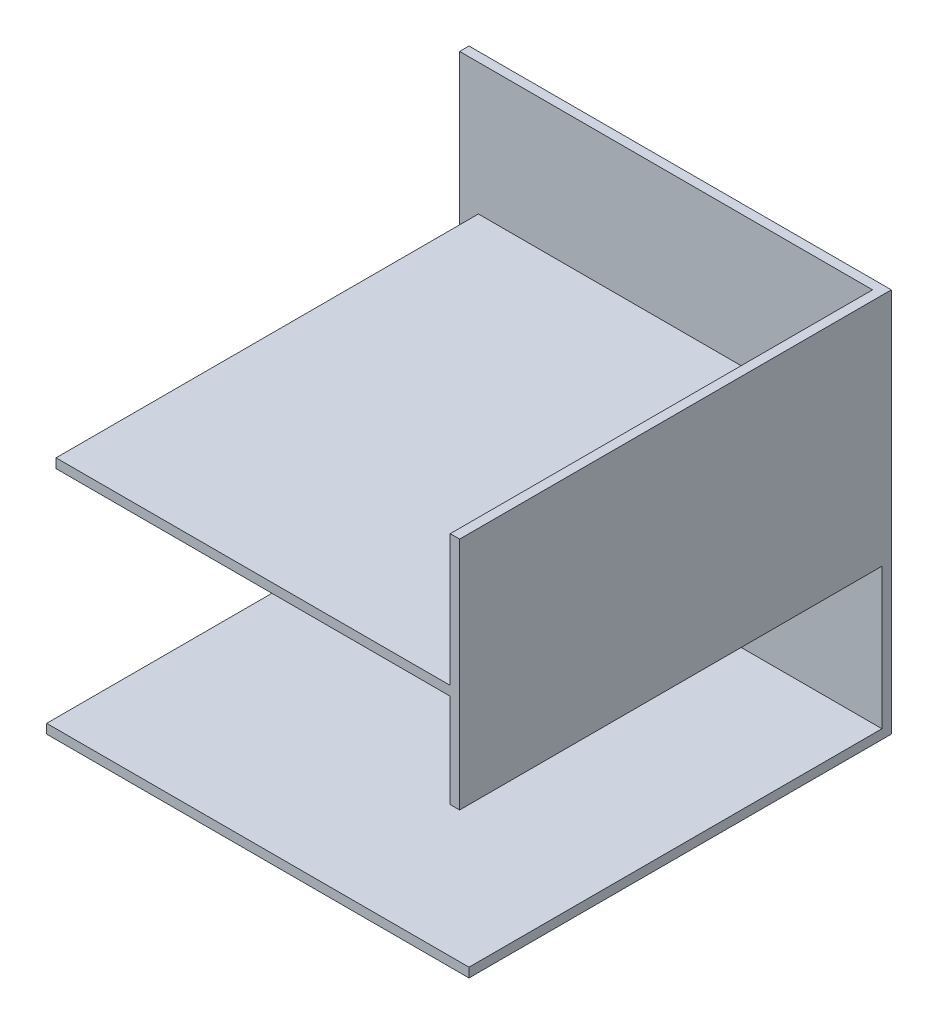
ISO-10303-21;
HEADER;
FILE_DESCRIPTION(('STEP AP214'),'2;1');
FILE_NAME('part.step','',(''),(''),'','','');
FILE_SCHEMA(('AUTOMOTIVE_DESIGN { 1 0 10303 214 1 1 1 1 }'));
ENDSEC;
DATA;
#1=APPLICATION_CONTEXT('core data for automotive mechanical design processes');
#2=APPLICATION_PROTOCOL_DEFINITION('international standard','automotive_design',2000,#1);
#3=PRODUCT_CONTEXT('',#1,'mechanical');
#4=PRODUCT('Part','Part','',(#3));
#5=PRODUCT_RELATED_PRODUCT_CATEGORY('part','',(#4));
#6=PRODUCT_DEFINITION_FORMATION('','',#4);
#7=PRODUCT_DEFINITION_CONTEXT('part definition',#1,'design');
#8=PRODUCT_DEFINITION('design','',#6,#7);
#9=PRODUCT_DEFINITION_SHAPE('','',#8);
#10=(LENGTH_UNIT() NAMED_UNIT(*) SI_UNIT(.MILLI.,.METRE.));
#11=(NAMED_UNIT(*) PLANE_ANGLE_UNIT() SI_UNIT($,.RADIAN.));
#12=(NAMED_UNIT(*) SI_UNIT($,.STERADIAN.) SOLID_ANGLE_UNIT());
#13=UNCERTAINTY_MEASURE_WITH_UNIT(LENGTH_MEASURE(1.E-05),#10,'distance_accuracy_value','');
#14=(GEOMETRIC_REPRESENTATION_CONTEXT(3) GLOBAL_UNCERTAINTY_ASSIGNED_CONTEXT((#13)) GLOBAL_UNIT_ASSIGNED_CONTEXT((#10,
#11,#12)) REPRESENTATION_CONTEXT('',''));
#15=CARTESIAN_POINT('',(0.,0.,0.));
#16=DIRECTION('',(0.,0.,1.));
#17=DIRECTION('',(1.,0.,0.));
#18=AXIS2_PLACEMENT_3D('',#15,#16,#17);
#19=CARTESIAN_POINT('',(-22.939262472885,404.753253796095,10.));
#20=DIRECTION('',(0.,0.,-1.));
#21=DIRECTION('',(-1.,0.,0.));
#22=AXIS2_PLACEMENT_3D('',#19,#20,#21);
#23=PLANE('',#22);
#24=DIRECTION('',(1.,0.,0.));
#25=VECTOR('',#24,1.);
#26=CARTESIAN_POINT('',(-2.93926247288504,254.753253796095,10.));
#27=LINE('',#26,#25);
#28=CARTESIAN_POINT('',(-2.93926247288504,254.753253796095,10.));
#29=VERTEX_POINT('',#28);
#30=CARTESIAN_POINT('',(417.060737527115,254.753253796095,10.));
#31=VERTEX_POINT('',#30);
#32=EDGE_CURVE('E338',#29,#31,#27,.T.);
#33=ORIENTED_EDGE('',*,*,#32,.F.);
#34=DIRECTION('',(0.,-1.,0.));
#35=VECTOR('',#34,1.);
#36=CARTESIAN_POINT('',(-2.93926247288504,264.753253796095,10.));
#37=LINE('',#36,#35);
#38=CARTESIAN_POINT('',(-2.93926247288504,264.753253796095,10.));
#39=VERTEX_POINT('',#38);
#40=EDGE_CURVE('E148',#39,#29,#37,.T.);
#41=ORIENTED_EDGE('',*,*,#40,.F.);
#42=DIRECTION('',(-1.,0.,0.));
#43=VECTOR('',#42,1.);
#44=CARTESIAN_POINT('',(-2.93926247288504,264.753253796095,10.));
#45=LINE('',#44,#43);
#46=CARTESIAN_POINT('',(417.060737527115,264.753253796096,10.));
#47=VERTEX_POINT('',#46);
#48=EDGE_CURVE('E144',#47,#39,#45,.T.);
#49=ORIENTED_EDGE('',*,*,#48,.F.);
#50=DIRECTION('',(0.,-1.,0.));
#51=VECTOR('',#50,1.);
#52=CARTESIAN_POINT('',(417.060737527115,404.753253796095,10.));
#53=LINE('',#52,#51);
#54=CARTESIAN_POINT('',(417.060737527115,404.753253796095,10.));
#55=VERTEX_POINT('',#54);
#56=EDGE_CURVE('E152',#55,#47,#53,.T.);
#57=ORIENTED_EDGE('',*,*,#56,.F.);
#58=DIRECTION('',(1.,0.,0.));
#59=VECTOR('',#58,1.);
#60=CARTESIAN_POINT('',(-22.939262472885,404.753253796095,10.));
#61=LINE('',#60,#59);
#62=CARTESIAN_POINT('',(-22.939262472885,404.753253796095,10.));
#63=VERTEX_POINT('',#62);
#64=EDGE_CURVE('E182',#63,#55,#61,.T.);
#65=ORIENTED_EDGE('',*,*,#64,.F.);
#66=DIRECTION('',(0.,-1.,0.));
#67=VECTOR('',#66,1.);
#68=CARTESIAN_POINT('',(-22.939262472885,404.753253796095,10.));
#69=LINE('',#68,#67);
#70=CARTESIAN_POINT('',(-22.939262472885,4.75325379609545,10.));
#71=VERTEX_POINT('',#70);
#72=EDGE_CURVE('E194',#63,#71,#69,.T.);
#73=ORIENTED_EDGE('',*,*,#72,.T.);
#74=DIRECTION('',(1.,0.,0.));
#75=VECTOR('',#74,1.);
#76=CARTESIAN_POINT('',(-22.939262472885,4.75325379609545,10.));
#77=LINE('',#76,#75);
#78=CARTESIAN_POINT('',(427.060737527115,4.75325379609545,10.));
#79=VERTEX_POINT('',#78);
#80=EDGE_CURVE('E56',#71,#79,#77,.T.);
#81=ORIENTED_EDGE('',*,*,#80,.T.);
#82=DIRECTION('',(0.,-1.,0.));
#83=VECTOR('',#82,1.);
#84=CARTESIAN_POINT('',(427.060737527115,404.753253796095,10.));
#85=LINE('',#84,#83);
#86=CARTESIAN_POINT('',(427.060737527115,154.753253796095,10.));
#87=VERTEX_POINT('',#86);
#88=EDGE_CURVE('E191',#87,#79,#85,.T.);
#89=ORIENTED_EDGE('',*,*,#88,.F.);
#90=DIRECTION('',(1.,0.,0.));
#91=VECTOR('',#90,1.);
#92=CARTESIAN_POINT('',(417.060737527115,154.753253796095,10.));
#93=LINE('',#92,#91);
#94=CARTESIAN_POINT('',(417.060737527115,154.753253796095,10.));
#95=VERTEX_POINT('',#94);
#96=EDGE_CURVE('E170',#95,#87,#93,.T.);
#97=ORIENTED_EDGE('',*,*,#96,.F.);
#98=EDGE_CURVE('E150',#31,#95,#53,.T.);
#99=ORIENTED_EDGE('',*,*,#98,.F.);
#100=EDGE_LOOP('',(#33,#41,#49,#57,#65,#73,#81,#89,#97,#99));
#101=FACE_BOUND('',#100,.T.);
#102=ADVANCED_FACE('F33',(#101),#23,.F.);
#103=CARTESIAN_POINT('',(417.060737527115,404.753253796095,460.));
#104=DIRECTION('',(1.,0.,0.));
#105=DIRECTION('',(0.,1.,0.));
#106=AXIS2_PLACEMENT_3D('',#103,#104,#105);
#107=PLANE('',#106);
#108=DIRECTION('',(0.,0.,-1.));
#109=VECTOR('',#108,1.);
#110=CARTESIAN_POINT('',(417.060737527115,254.753253796095,460.));
#111=LINE('',#110,#109);
#112=CARTESIAN_POINT('',(417.060737527115,254.753253796095,460.));
#113=VERTEX_POINT('',#112);
#114=EDGE_CURVE('E48',#113,#31,#111,.T.);
#115=ORIENTED_EDGE('',*,*,#114,.T.);
#116=ORIENTED_EDGE('',*,*,#98,.T.);
#117=DIRECTION('',(0.,0.,-1.));
#118=VECTOR('',#117,1.);
#119=CARTESIAN_POINT('',(417.060737527115,154.753253796095,460.));
#120=LINE('',#119,#118);
#121=CARTESIAN_POINT('',(417.060737527115,154.753253796095,460.));
#122=VERTEX_POINT('',#121);
#123=EDGE_CURVE('E176',#122,#95,#120,.T.);
#124=ORIENTED_EDGE('',*,*,#123,.F.);
#125=DIRECTION('',(0.,-1.,0.));
#126=VECTOR('',#125,1.);
#127=CARTESIAN_POINT('',(417.060737527115,404.753253796095,460.));
#128=LINE('',#127,#126);
#129=EDGE_CURVE('E161',#113,#122,#128,.T.);
#130=ORIENTED_EDGE('',*,*,#129,.F.);
#131=EDGE_LOOP('',(#115,#116,#124,#130));
#132=FACE_BOUND('',#131,.T.);
#133=ADVANCED_FACE('F253',(#132),#107,.F.);
#134=DIRECTION('',(0.,0.,-1.));
#135=VECTOR('',#134,1.);
#136=CARTESIAN_POINT('',(417.060737527115,264.753253796096,460.));
#137=LINE('',#136,#135);
#138=CARTESIAN_POINT('',(417.060737527115,264.753253796096,460.));
#139=VERTEX_POINT('',#138);
#140=EDGE_CURVE('E154',#139,#47,#137,.T.);
#141=ORIENTED_EDGE('',*,*,#140,.F.);
#142=CARTESIAN_POINT('',(417.060737527115,404.753253796095,460.));
#143=VERTEX_POINT('',#142);
#144=EDGE_CURVE('E158',#143,#139,#128,.T.);
#145=ORIENTED_EDGE('',*,*,#144,.F.);
#146=DIRECTION('',(0.,0.,-1.));
#147=VECTOR('',#146,1.);
#148=CARTESIAN_POINT('',(417.060737527115,404.753253796095,460.));
#149=LINE('',#148,#147);
#150=EDGE_CURVE('E167',#143,#55,#149,.T.);
#151=ORIENTED_EDGE('',*,*,#150,.T.);
#152=ORIENTED_EDGE('',*,*,#56,.T.);
#153=EDGE_LOOP('',(#141,#145,#151,#152));
#154=FACE_BOUND('',#153,.T.);
#155=ADVANCED_FACE('F243',(#154),#107,.F.);
#156=CARTESIAN_POINT('',(-22.939262472885,4.75325379609545,450.));
#157=DIRECTION('',(0.,-1.,0.));
#158=DIRECTION('',(0.,0.,-1.));
#159=AXIS2_PLACEMENT_3D('',#156,#157,#158);
#160=PLANE('',#159);
#161=ORIENTED_EDGE('',*,*,#80,.F.);
#162=DIRECTION('',(0.,0.,-1.));
#163=VECTOR('',#162,1.);
#164=CARTESIAN_POINT('',(-22.939262472885,4.75325379609545,450.));
#165=LINE('',#164,#163);
#166=CARTESIAN_POINT('',(-22.939262472885,4.75325379609545,450.));
#167=VERTEX_POINT('',#166);
#168=EDGE_CURVE('E208',#167,#71,#165,.T.);
#169=ORIENTED_EDGE('',*,*,#168,.F.);
#170=DIRECTION('',(-1.,0.,0.));
#171=VECTOR('',#170,1.);
#172=CARTESIAN_POINT('',(-22.939262472885,4.75325379609545,450.));
#173=LINE('',#172,#171);
#174=CARTESIAN_POINT('',(427.060737527115,4.75325379609545,450.));
#175=VERTEX_POINT('',#174);
#176=EDGE_CURVE('E206',#175,#167,#173,.T.);
#177=ORIENTED_EDGE('',*,*,#176,.F.);
#178=DIRECTION('',(0.,0.,-1.));
#179=VECTOR('',#178,1.);
#180=CARTESIAN_POINT('',(427.060737527115,4.75325379609545,450.));
#181=LINE('',#180,#179);
#182=EDGE_CURVE('E215',#175,#79,#181,.T.);
#183=ORIENTED_EDGE('',*,*,#182,.T.);
#184=EDGE_LOOP('',(#161,#169,#177,#183));
#185=FACE_BOUND('',#184,.T.);
#186=ADVANCED_FACE('F260',(#185),#160,.F.);
#187=CARTESIAN_POINT('',(-22.939262472885,4.75325379609545,450.));
#188=DIRECTION('',(1.,0.,0.));
#189=DIRECTION('',(0.,1.,0.));
#190=AXIS2_PLACEMENT_3D('',#187,#188,#189);
#191=PLANE('',#190);
#192=DIRECTION('',(0.,-1.,0.));
#193=VECTOR('',#192,1.);
#194=CARTESIAN_POINT('',(-22.939262472885,4.75325379609545,0.));
#195=LINE('',#194,#193);
#196=CARTESIAN_POINT('',(-22.939262472885,404.753253796095,0.));
#197=VERTEX_POINT('',#196);
#198=CARTESIAN_POINT('',(-22.939262472885,-5.24674620390455,0.));
#199=VERTEX_POINT('',#198);
#200=EDGE_CURVE('E197',#197,#199,#195,.T.);
#201=ORIENTED_EDGE('',*,*,#200,.T.);
#202=DIRECTION('',(0.,0.,-1.));
#203=VECTOR('',#202,1.);
#204=CARTESIAN_POINT('',(-22.939262472885,-5.24674620390455,450.));
#205=LINE('',#204,#203);
#206=CARTESIAN_POINT('',(-22.939262472885,-5.24674620390455,450.));
#207=VERTEX_POINT('',#206);
#208=EDGE_CURVE('E11',#207,#199,#205,.T.);
#209=ORIENTED_EDGE('',*,*,#208,.F.);
#210=DIRECTION('',(0.,-1.,0.));
#211=VECTOR('',#210,1.);
#212=CARTESIAN_POINT('',(-22.939262472885,4.75325379609545,450.));
#213=LINE('',#212,#211);
#214=EDGE_CURVE('E198',#167,#207,#213,.T.);
#215=ORIENTED_EDGE('',*,*,#214,.F.);
#216=ORIENTED_EDGE('',*,*,#168,.T.);
#217=ORIENTED_EDGE('',*,*,#72,.F.);
#218=DIRECTION('',(0.,0.,1.));
#219=VECTOR('',#218,1.);
#220=CARTESIAN_POINT('',(-22.939262472885,404.753253796095,10.));
#221=LINE('',#220,#219);
#222=EDGE_CURVE('E179',#197,#63,#221,.T.);
#223=ORIENTED_EDGE('',*,*,#222,.F.);
#224=EDGE_LOOP('',(#201,#209,#215,#216,#217,#223));
#225=FACE_BOUND('',#224,.T.);
#226=ADVANCED_FACE('F35',(#225),#191,.F.);
#227=CARTESIAN_POINT('',(-22.939262472885,-5.24674620390455,450.));
#228=DIRECTION('',(0.,1.,0.));
#229=DIRECTION('',(0.,0.,1.));
#230=AXIS2_PLACEMENT_3D('',#227,#228,#229);
#231=PLANE('',#230);
#232=DIRECTION('',(1.,0.,0.));
#233=VECTOR('',#232,1.);
#234=CARTESIAN_POINT('',(-22.939262472885,-5.24674620390455,0.));
#235=LINE('',#234,#233);
#236=CARTESIAN_POINT('',(427.060737527115,-5.24674620390455,0.));
#237=VERTEX_POINT('',#236);
#238=EDGE_CURVE('E211',#199,#237,#235,.T.);
#239=ORIENTED_EDGE('',*,*,#238,.T.);
#240=DIRECTION('',(0.,0.,-1.));
#241=VECTOR('',#240,1.);
#242=CARTESIAN_POINT('',(427.060737527115,-5.24674620390455,450.));
#243=LINE('',#242,#241);
#244=CARTESIAN_POINT('',(427.060737527115,-5.24674620390455,450.));
#245=VERTEX_POINT('',#244);
#246=EDGE_CURVE('E41',#245,#237,#243,.T.);
#247=ORIENTED_EDGE('',*,*,#246,.F.);
#248=DIRECTION('',(1.,0.,0.));
#249=VECTOR('',#248,1.);
#250=CARTESIAN_POINT('',(-22.939262472885,-5.24674620390455,450.));
#251=LINE('',#250,#249);
#252=EDGE_CURVE('E201',#207,#245,#251,.T.);
#253=ORIENTED_EDGE('',*,*,#252,.F.);
#254=ORIENTED_EDGE('',*,*,#208,.T.);
#255=EDGE_LOOP('',(#239,#247,#253,#254));
#256=FACE_BOUND('',#255,.T.);
#257=ADVANCED_FACE('F276',(#256),#231,.F.);
#258=CARTESIAN_POINT('',(427.060737527115,4.75325379609545,450.));
#259=DIRECTION('',(-1.,0.,0.));
#260=DIRECTION('',(0.,0.,1.));
#261=AXIS2_PLACEMENT_3D('',#258,#259,#260);
#262=PLANE('',#261);
#263=DIRECTION('',(0.,1.,0.));
#264=VECTOR('',#263,1.);
#265=CARTESIAN_POINT('',(427.060737527115,4.75325379609545,0.));
#266=LINE('',#265,#264);
#267=CARTESIAN_POINT('',(427.060737527115,404.753253796095,0.));
#268=VERTEX_POINT('',#267);
#269=EDGE_CURVE('E202',#237,#268,#266,.T.);
#270=ORIENTED_EDGE('',*,*,#269,.T.);
#271=DIRECTION('',(0.,0.,-1.));
#272=VECTOR('',#271,1.);
#273=CARTESIAN_POINT('',(427.060737527115,404.753253796095,10.));
#274=LINE('',#273,#272);
#275=CARTESIAN_POINT('',(427.060737527115,404.753253796095,460.));
#276=VERTEX_POINT('',#275);
#277=EDGE_CURVE('E185',#276,#268,#274,.T.);
#278=ORIENTED_EDGE('',*,*,#277,.F.);
#279=DIRECTION('',(0.,1.,0.));
#280=VECTOR('',#279,1.);
#281=CARTESIAN_POINT('',(427.060737527115,404.753253796095,460.));
#282=LINE('',#281,#280);
#283=CARTESIAN_POINT('',(427.060737527115,154.753253796095,460.));
#284=VERTEX_POINT('',#283);
#285=EDGE_CURVE('E163',#284,#276,#282,.T.);
#286=ORIENTED_EDGE('',*,*,#285,.F.);
#287=DIRECTION('',(0.,0.,-1.));
#288=VECTOR('',#287,1.);
#289=CARTESIAN_POINT('',(427.060737527115,154.753253796095,460.));
#290=LINE('',#289,#288);
#291=EDGE_CURVE('E173',#284,#87,#290,.T.);
#292=ORIENTED_EDGE('',*,*,#291,.T.);
#293=ORIENTED_EDGE('',*,*,#88,.T.);
#294=ORIENTED_EDGE('',*,*,#182,.F.);
#295=DIRECTION('',(0.,1.,0.));
#296=VECTOR('',#295,1.);
#297=CARTESIAN_POINT('',(427.060737527115,4.75325379609545,450.));
#298=LINE('',#297,#296);
#299=EDGE_CURVE('E204',#245,#175,#298,.T.);
#300=ORIENTED_EDGE('',*,*,#299,.F.);
#301=ORIENTED_EDGE('',*,*,#246,.T.);
#302=EDGE_LOOP('',(#270,#278,#286,#292,#293,#294,#300,#301));
#303=FACE_BOUND('',#302,.T.);
#304=ADVANCED_FACE('F221',(#303),#262,.F.);
#305=CARTESIAN_POINT('',(0.,0.,450.));
#306=DIRECTION('',(0.,0.,1.));
#307=DIRECTION('',(1.,0.,0.));
#308=AXIS2_PLACEMENT_3D('',#305,#306,#307);
#309=PLANE('',#308);
#310=ORIENTED_EDGE('',*,*,#214,.T.);
#311=ORIENTED_EDGE('',*,*,#252,.T.);
#312=ORIENTED_EDGE('',*,*,#299,.T.);
#313=ORIENTED_EDGE('',*,*,#176,.T.);
#314=EDGE_LOOP('',(#310,#311,#312,#313));
#315=FACE_BOUND('',#314,.T.);
#316=ADVANCED_FACE('F267',(#315),#309,.T.);
#317=CARTESIAN_POINT('',(0.,0.,0.));
#318=DIRECTION('',(0.,0.,1.));
#319=DIRECTION('',(1.,0.,0.));
#320=AXIS2_PLACEMENT_3D('',#317,#318,#319);
#321=PLANE('',#320);
#322=ORIENTED_EDGE('',*,*,#200,.F.);
#323=DIRECTION('',(-1.,0.,0.));
#324=VECTOR('',#323,1.);
#325=CARTESIAN_POINT('',(-22.939262472885,404.753253796095,0.));
#326=LINE('',#325,#324);
#327=EDGE_CURVE('E188',#268,#197,#326,.T.);
#328=ORIENTED_EDGE('',*,*,#327,.F.);
#329=ORIENTED_EDGE('',*,*,#269,.F.);
#330=ORIENTED_EDGE('',*,*,#238,.F.);
#331=EDGE_LOOP('',(#322,#328,#329,#330));
#332=FACE_BOUND('',#331,.T.);
#333=ADVANCED_FACE('F226',(#332),#321,.F.);
#334=CARTESIAN_POINT('',(0.,404.753253796095,0.));
#335=DIRECTION('',(0.,-1.,0.));
#336=DIRECTION('',(0.,0.,-1.));
#337=AXIS2_PLACEMENT_3D('',#334,#335,#336);
#338=PLANE('',#337);
#339=ORIENTED_EDGE('',*,*,#222,.T.);
#340=ORIENTED_EDGE('',*,*,#64,.T.);
#341=ORIENTED_EDGE('',*,*,#150,.F.);
#342=DIRECTION('',(-1.,0.,0.));
#343=VECTOR('',#342,1.);
#344=CARTESIAN_POINT('',(417.060737527115,404.753253796095,460.));
#345=LINE('',#344,#343);
#346=EDGE_CURVE('E166',#276,#143,#345,.T.);
#347=ORIENTED_EDGE('',*,*,#346,.F.);
#348=ORIENTED_EDGE('',*,*,#277,.T.);
#349=ORIENTED_EDGE('',*,*,#327,.T.);
#350=EDGE_LOOP('',(#339,#340,#341,#347,#348,#349));
#351=FACE_BOUND('',#350,.T.);
#352=ADVANCED_FACE('F229',(#351),#338,.F.);
#353=CARTESIAN_POINT('',(417.060737527115,154.753253796095,460.));
#354=DIRECTION('',(0.,1.,0.));
#355=DIRECTION('',(0.,0.,1.));
#356=AXIS2_PLACEMENT_3D('',#353,#354,#355);
#357=PLANE('',#356);
#358=ORIENTED_EDGE('',*,*,#96,.T.);
#359=ORIENTED_EDGE('',*,*,#291,.F.);
#360=DIRECTION('',(1.,0.,0.));
#361=VECTOR('',#360,1.);
#362=CARTESIAN_POINT('',(417.060737527115,154.753253796095,460.));
#363=LINE('',#362,#361);
#364=EDGE_CURVE('E160',#122,#284,#363,.T.);
#365=ORIENTED_EDGE('',*,*,#364,.F.);
#366=ORIENTED_EDGE('',*,*,#123,.T.);
#367=EDGE_LOOP('',(#358,#359,#365,#366));
#368=FACE_BOUND('',#367,.T.);
#369=ADVANCED_FACE('F250',(#368),#357,.F.);
#370=CARTESIAN_POINT('',(0.,0.,460.));
#371=DIRECTION('',(0.,0.,1.));
#372=DIRECTION('',(1.,0.,0.));
#373=AXIS2_PLACEMENT_3D('',#370,#371,#372);
#374=PLANE('',#373);
#375=ORIENTED_EDGE('',*,*,#144,.T.);
#376=DIRECTION('',(-1.,0.,0.));
#377=VECTOR('',#376,1.);
#378=CARTESIAN_POINT('',(-2.93926247288504,264.753253796095,460.));
#379=LINE('',#378,#377);
#380=CARTESIAN_POINT('',(-2.93926247288504,264.753253796095,460.));
#381=VERTEX_POINT('',#380);
#382=EDGE_CURVE('E135',#139,#381,#379,.T.);
#383=ORIENTED_EDGE('',*,*,#382,.T.);
#384=DIRECTION('',(0.,-1.,0.));
#385=VECTOR('',#384,1.);
#386=CARTESIAN_POINT('',(-2.93926247288504,264.753253796095,460.));
#387=LINE('',#386,#385);
#388=CARTESIAN_POINT('',(-2.93926247288504,254.753253796095,460.));
#389=VERTEX_POINT('',#388);
#390=EDGE_CURVE('E136',#381,#389,#387,.T.);
#391=ORIENTED_EDGE('',*,*,#390,.T.);
#392=DIRECTION('',(1.,0.,0.));
#393=VECTOR('',#392,1.);
#394=CARTESIAN_POINT('',(-2.93926247288504,254.753253796095,460.));
#395=LINE('',#394,#393);
#396=EDGE_CURVE('E127',#389,#113,#395,.T.);
#397=ORIENTED_EDGE('',*,*,#396,.T.);
#398=ORIENTED_EDGE('',*,*,#129,.T.);
#399=ORIENTED_EDGE('',*,*,#364,.T.);
#400=ORIENTED_EDGE('',*,*,#285,.T.);
#401=ORIENTED_EDGE('',*,*,#346,.T.);
#402=EDGE_LOOP('',(#375,#383,#391,#397,#398,#399,#400,#401));
#403=FACE_BOUND('',#402,.T.);
#404=ADVANCED_FACE('F140',(#403),#374,.T.);
#405=CARTESIAN_POINT('',(-2.93926247288504,264.753253796095,460.));
#406=DIRECTION('',(1.,0.,0.));
#407=DIRECTION('',(0.,0.,-1.));
#408=AXIS2_PLACEMENT_3D('',#405,#406,#407);
#409=PLANE('',#408);
#410=ORIENTED_EDGE('',*,*,#40,.T.);
#411=DIRECTION('',(0.,0.,-1.));
#412=VECTOR('',#411,1.);
#413=CARTESIAN_POINT('',(-2.93926247288504,254.753253796095,460.));
#414=LINE('',#413,#412);
#415=EDGE_CURVE('E131',#389,#29,#414,.T.);
#416=ORIENTED_EDGE('',*,*,#415,.F.);
#417=ORIENTED_EDGE('',*,*,#390,.F.);
#418=DIRECTION('',(0.,0.,-1.));
#419=VECTOR('',#418,1.);
#420=CARTESIAN_POINT('',(-2.93926247288504,264.753253796095,460.));
#421=LINE('',#420,#419);
#422=EDGE_CURVE('E337',#381,#39,#421,.T.);
#423=ORIENTED_EDGE('',*,*,#422,.T.);
#424=EDGE_LOOP('',(#410,#416,#417,#423));
#425=FACE_BOUND('',#424,.T.);
#426=ADVANCED_FACE('F146',(#425),#409,.F.);
#427=CARTESIAN_POINT('',(-2.93926247288504,254.753253796095,460.));
#428=DIRECTION('',(0.,1.,0.));
#429=DIRECTION('',(0.,0.,1.));
#430=AXIS2_PLACEMENT_3D('',#427,#428,#429);
#431=PLANE('',#430);
#432=ORIENTED_EDGE('',*,*,#32,.T.);
#433=ORIENTED_EDGE('',*,*,#114,.F.);
#434=ORIENTED_EDGE('',*,*,#396,.F.);
#435=ORIENTED_EDGE('',*,*,#415,.T.);
#436=EDGE_LOOP('',(#432,#433,#434,#435));
#437=FACE_BOUND('',#436,.T.);
#438=ADVANCED_FACE('F129',(#437),#431,.F.);
#439=CARTESIAN_POINT('',(-2.93926247288504,264.753253796095,460.));
#440=DIRECTION('',(0.,-1.,0.));
#441=DIRECTION('',(1.,0.,0.));
#442=AXIS2_PLACEMENT_3D('',#439,#440,#441);
#443=PLANE('',#442);
#444=ORIENTED_EDGE('',*,*,#48,.T.);
#445=ORIENTED_EDGE('',*,*,#422,.F.);
#446=ORIENTED_EDGE('',*,*,#382,.F.);
#447=ORIENTED_EDGE('',*,*,#140,.T.);
#448=EDGE_LOOP('',(#444,#445,#446,#447));
#449=FACE_BOUND('',#448,.T.);
#450=ADVANCED_FACE('F324',(#449),#443,.F.);
#451=CLOSED_SHELL('',(#102,#133,#155,#186,#226,#257,#304,#316,#333,#352,#369,#404,#426,#438,#450));
#452=MANIFOLD_SOLID_BREP('B2',#451);
#453=ADVANCED_BREP_SHAPE_REPRESENTATION('',(#18,#452),#14);
#454=SHAPE_DEFINITION_REPRESENTATION(#9,#453);
ENDSEC;
END-ISO-10303-21;
